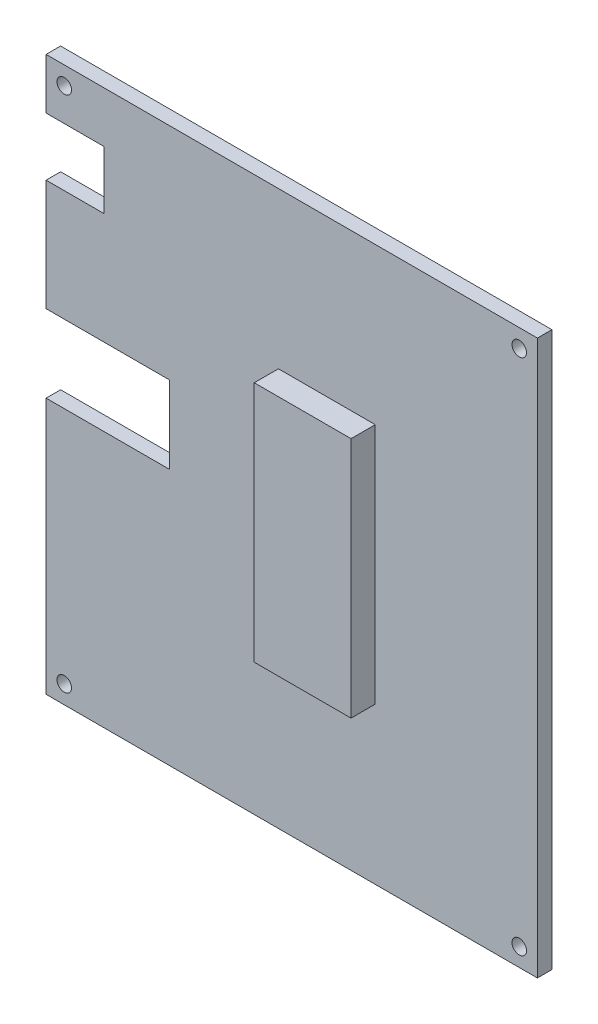
ISO-10303-21;
HEADER;
FILE_DESCRIPTION(('STEP AP214'),'2;1');
FILE_NAME('part.step','',(''),(''),'','','');
FILE_SCHEMA(('AUTOMOTIVE_DESIGN { 1 0 10303 214 1 1 1 1 }'));
ENDSEC;
DATA;
#1=APPLICATION_CONTEXT('core data for automotive mechanical design processes');
#2=APPLICATION_PROTOCOL_DEFINITION('international standard','automotive_design',2000,#1);
#3=PRODUCT_CONTEXT('',#1,'mechanical');
#4=PRODUCT('Part','Part','',(#3));
#5=PRODUCT_RELATED_PRODUCT_CATEGORY('part','',(#4));
#6=PRODUCT_DEFINITION_FORMATION('','',#4);
#7=PRODUCT_DEFINITION_CONTEXT('part definition',#1,'design');
#8=PRODUCT_DEFINITION('design','',#6,#7);
#9=PRODUCT_DEFINITION_SHAPE('','',#8);
#10=(LENGTH_UNIT() NAMED_UNIT(*) SI_UNIT(.MILLI.,.METRE.));
#11=(NAMED_UNIT(*) PLANE_ANGLE_UNIT() SI_UNIT($,.RADIAN.));
#12=(NAMED_UNIT(*) SI_UNIT($,.STERADIAN.) SOLID_ANGLE_UNIT());
#13=UNCERTAINTY_MEASURE_WITH_UNIT(LENGTH_MEASURE(1.E-05),#10,'distance_accuracy_value','');
#14=(GEOMETRIC_REPRESENTATION_CONTEXT(3) GLOBAL_UNCERTAINTY_ASSIGNED_CONTEXT((#13)) GLOBAL_UNIT_ASSIGNED_CONTEXT((#10,
#11,#12)) REPRESENTATION_CONTEXT('',''));
#15=CARTESIAN_POINT('',(0.,0.,0.));
#16=DIRECTION('',(0.,0.,1.));
#17=DIRECTION('',(1.,0.,0.));
#18=AXIS2_PLACEMENT_3D('',#15,#16,#17);
#19=CARTESIAN_POINT('',(50.75,-119.174028952859,3.));
#20=DIRECTION('',(-1.,0.,0.));
#21=DIRECTION('',(0.,0.,1.));
#22=AXIS2_PLACEMENT_3D('',#19,#20,#21);
#23=PLANE('',#22);
#24=DIRECTION('',(0.,1.,0.));
#25=VECTOR('',#24,1.);
#26=CARTESIAN_POINT('',(50.75,-119.174028952859,0.));
#27=LINE('',#26,#25);
#28=CARTESIAN_POINT('',(50.75,-57.25,0.));
#29=VERTEX_POINT('',#28);
#30=CARTESIAN_POINT('',(50.75,57.25,0.));
#31=VERTEX_POINT('',#30);
#32=EDGE_CURVE('E238',#29,#31,#27,.T.);
#33=ORIENTED_EDGE('',*,*,#32,.T.);
#34=DIRECTION('',(0.,0.,-1.));
#35=VECTOR('',#34,1.);
#36=CARTESIAN_POINT('',(50.75,57.25,3.));
#37=LINE('',#36,#35);
#38=CARTESIAN_POINT('',(50.75,57.25,3.));
#39=VERTEX_POINT('',#38);
#40=EDGE_CURVE('E11',#39,#31,#37,.T.);
#41=ORIENTED_EDGE('',*,*,#40,.F.);
#42=DIRECTION('',(0.,1.,0.));
#43=VECTOR('',#42,1.);
#44=CARTESIAN_POINT('',(50.75,-119.174028952859,3.));
#45=LINE('',#44,#43);
#46=CARTESIAN_POINT('',(50.75,-57.25,3.));
#47=VERTEX_POINT('',#46);
#48=EDGE_CURVE('E201',#47,#39,#45,.T.);
#49=ORIENTED_EDGE('',*,*,#48,.F.);
#50=DIRECTION('',(0.,0.,-1.));
#51=VECTOR('',#50,1.);
#52=CARTESIAN_POINT('',(50.75,-57.25,3.));
#53=LINE('',#52,#51);
#54=EDGE_CURVE('E226',#47,#29,#53,.T.);
#55=ORIENTED_EDGE('',*,*,#54,.T.);
#56=EDGE_LOOP('',(#33,#41,#49,#55));
#57=FACE_BOUND('',#56,.T.);
#58=ADVANCED_FACE('F37',(#57),#23,.F.);
#59=CARTESIAN_POINT('',(0.,57.25,3.));
#60=DIRECTION('',(0.,-1.,0.));
#61=DIRECTION('',(0.,0.,-1.));
#62=AXIS2_PLACEMENT_3D('',#59,#60,#61);
#63=PLANE('',#62);
#64=DIRECTION('',(-1.,0.,0.));
#65=VECTOR('',#64,1.);
#66=CARTESIAN_POINT('',(0.,57.25,0.));
#67=LINE('',#66,#65);
#68=CARTESIAN_POINT('',(-50.75,57.25,0.));
#69=VERTEX_POINT('',#68);
#70=EDGE_CURVE('E241',#31,#69,#67,.T.);
#71=ORIENTED_EDGE('',*,*,#70,.T.);
#72=DIRECTION('',(0.,0.,-1.));
#73=VECTOR('',#72,1.);
#74=CARTESIAN_POINT('',(-50.75,57.25,3.));
#75=LINE('',#74,#73);
#76=CARTESIAN_POINT('',(-50.75,57.25,3.));
#77=VERTEX_POINT('',#76);
#78=EDGE_CURVE('E45',#77,#69,#75,.T.);
#79=ORIENTED_EDGE('',*,*,#78,.F.);
#80=DIRECTION('',(-1.,0.,0.));
#81=VECTOR('',#80,1.);
#82=CARTESIAN_POINT('',(0.,57.25,3.));
#83=LINE('',#82,#81);
#84=EDGE_CURVE('E204',#39,#77,#83,.T.);
#85=ORIENTED_EDGE('',*,*,#84,.F.);
#86=ORIENTED_EDGE('',*,*,#40,.T.);
#87=EDGE_LOOP('',(#71,#79,#85,#86));
#88=FACE_BOUND('',#87,.T.);
#89=ADVANCED_FACE('F318',(#88),#63,.F.);
#90=CARTESIAN_POINT('',(-50.75,-119.174028952859,3.));
#91=DIRECTION('',(1.,0.,0.));
#92=DIRECTION('',(0.,0.,-1.));
#93=AXIS2_PLACEMENT_3D('',#90,#91,#92);
#94=PLANE('',#93);
#95=DIRECTION('',(0.,-1.,0.));
#96=VECTOR('',#95,1.);
#97=CARTESIAN_POINT('',(-50.75,-119.174028952859,0.));
#98=LINE('',#97,#96);
#99=CARTESIAN_POINT('',(-50.75,46.75,0.));
#100=VERTEX_POINT('',#99);
#101=EDGE_CURVE('E243',#69,#100,#98,.T.);
#102=ORIENTED_EDGE('',*,*,#101,.T.);
#103=DIRECTION('',(0.,0.,-1.));
#104=VECTOR('',#103,1.);
#105=CARTESIAN_POINT('',(-50.75,46.75,3.));
#106=LINE('',#105,#104);
#107=CARTESIAN_POINT('',(-50.75,46.75,3.));
#108=VERTEX_POINT('',#107);
#109=EDGE_CURVE('E288',#108,#100,#106,.T.);
#110=ORIENTED_EDGE('',*,*,#109,.F.);
#111=DIRECTION('',(0.,-1.,0.));
#112=VECTOR('',#111,1.);
#113=CARTESIAN_POINT('',(-50.75,-119.174028952859,3.));
#114=LINE('',#113,#112);
#115=EDGE_CURVE('E206',#77,#108,#114,.T.);
#116=ORIENTED_EDGE('',*,*,#115,.F.);
#117=ORIENTED_EDGE('',*,*,#78,.T.);
#118=EDGE_LOOP('',(#102,#110,#116,#117));
#119=FACE_BOUND('',#118,.T.);
#120=ADVANCED_FACE('F295',(#119),#94,.F.);
#121=CARTESIAN_POINT('',(-1.80267248250089E-13,46.7500000000001,3.));
#122=DIRECTION('',(0.,1.,0.));
#123=DIRECTION('',(-1.,0.,0.));
#124=AXIS2_PLACEMENT_3D('',#121,#122,#123);
#125=PLANE('',#124);
#126=DIRECTION('',(1.,0.,0.));
#127=VECTOR('',#126,1.);
#128=CARTESIAN_POINT('',(-1.80267248250089E-13,46.7500000000001,0.));
#129=LINE('',#128,#127);
#130=CARTESIAN_POINT('',(-38.75,46.75,0.));
#131=VERTEX_POINT('',#130);
#132=EDGE_CURVE('E245',#100,#131,#129,.T.);
#133=ORIENTED_EDGE('',*,*,#132,.T.);
#134=DIRECTION('',(0.,0.,-1.));
#135=VECTOR('',#134,1.);
#136=CARTESIAN_POINT('',(-38.75,46.75,3.));
#137=LINE('',#136,#135);
#138=CARTESIAN_POINT('',(-38.75,46.75,3.));
#139=VERTEX_POINT('',#138);
#140=EDGE_CURVE('E285',#139,#131,#137,.T.);
#141=ORIENTED_EDGE('',*,*,#140,.F.);
#142=DIRECTION('',(1.,0.,0.));
#143=VECTOR('',#142,1.);
#144=CARTESIAN_POINT('',(-1.80267248250089E-13,46.7500000000001,3.));
#145=LINE('',#144,#143);
#146=EDGE_CURVE('E208',#108,#139,#145,.T.);
#147=ORIENTED_EDGE('',*,*,#146,.F.);
#148=ORIENTED_EDGE('',*,*,#109,.T.);
#149=EDGE_LOOP('',(#133,#141,#147,#148));
#150=FACE_BOUND('',#149,.T.);
#151=ADVANCED_FACE('F306',(#150),#125,.F.);
#152=CARTESIAN_POINT('',(-38.75,-119.174028952859,3.));
#153=DIRECTION('',(1.,0.,0.));
#154=DIRECTION('',(0.,0.,-1.));
#155=AXIS2_PLACEMENT_3D('',#152,#153,#154);
#156=PLANE('',#155);
#157=DIRECTION('',(0.,-1.,0.));
#158=VECTOR('',#157,1.);
#159=CARTESIAN_POINT('',(-38.75,-119.174028952859,0.));
#160=LINE('',#159,#158);
#161=CARTESIAN_POINT('',(-38.75,34.75,0.));
#162=VERTEX_POINT('',#161);
#163=EDGE_CURVE('E247',#131,#162,#160,.T.);
#164=ORIENTED_EDGE('',*,*,#163,.T.);
#165=DIRECTION('',(0.,0.,-1.));
#166=VECTOR('',#165,1.);
#167=CARTESIAN_POINT('',(-38.75,34.75,3.));
#168=LINE('',#167,#166);
#169=CARTESIAN_POINT('',(-38.75,34.75,3.));
#170=VERTEX_POINT('',#169);
#171=EDGE_CURVE('E282',#170,#162,#168,.T.);
#172=ORIENTED_EDGE('',*,*,#171,.F.);
#173=DIRECTION('',(0.,-1.,0.));
#174=VECTOR('',#173,1.);
#175=CARTESIAN_POINT('',(-38.75,-119.174028952859,3.));
#176=LINE('',#175,#174);
#177=EDGE_CURVE('E210',#139,#170,#176,.T.);
#178=ORIENTED_EDGE('',*,*,#177,.F.);
#179=ORIENTED_EDGE('',*,*,#140,.T.);
#180=EDGE_LOOP('',(#164,#172,#178,#179));
#181=FACE_BOUND('',#180,.T.);
#182=ADVANCED_FACE('F310',(#181),#156,.F.);
#183=CARTESIAN_POINT('',(1.00626166099184E-13,34.75,3.));
#184=DIRECTION('',(0.,-1.,0.));
#185=DIRECTION('',(1.,0.,0.));
#186=AXIS2_PLACEMENT_3D('',#183,#184,#185);
#187=PLANE('',#186);
#188=DIRECTION('',(-1.,0.,0.));
#189=VECTOR('',#188,1.);
#190=CARTESIAN_POINT('',(1.00626166099184E-13,34.75,0.));
#191=LINE('',#190,#189);
#192=CARTESIAN_POINT('',(-50.75,34.75,0.));
#193=VERTEX_POINT('',#192);
#194=EDGE_CURVE('E249',#162,#193,#191,.T.);
#195=ORIENTED_EDGE('',*,*,#194,.T.);
#196=DIRECTION('',(0.,0.,-1.));
#197=VECTOR('',#196,1.);
#198=CARTESIAN_POINT('',(-50.75,34.75,3.));
#199=LINE('',#198,#197);
#200=CARTESIAN_POINT('',(-50.75,34.75,3.));
#201=VERTEX_POINT('',#200);
#202=EDGE_CURVE('E279',#201,#193,#199,.T.);
#203=ORIENTED_EDGE('',*,*,#202,.F.);
#204=DIRECTION('',(-1.,0.,0.));
#205=VECTOR('',#204,1.);
#206=CARTESIAN_POINT('',(1.00626166099184E-13,34.75,3.));
#207=LINE('',#206,#205);
#208=EDGE_CURVE('E212',#170,#201,#207,.T.);
#209=ORIENTED_EDGE('',*,*,#208,.F.);
#210=ORIENTED_EDGE('',*,*,#171,.T.);
#211=EDGE_LOOP('',(#195,#203,#209,#210));
#212=FACE_BOUND('',#211,.T.);
#213=ADVANCED_FACE('F351',(#212),#187,.F.);
#214=CARTESIAN_POINT('',(-50.75,-119.174028952859,3.));
#215=DIRECTION('',(1.,0.,0.));
#216=DIRECTION('',(0.,0.,-1.));
#217=AXIS2_PLACEMENT_3D('',#214,#215,#216);
#218=PLANE('',#217);
#219=DIRECTION('',(0.,-1.,0.));
#220=VECTOR('',#219,1.);
#221=CARTESIAN_POINT('',(-50.75,-119.174028952859,0.));
#222=LINE('',#221,#220);
#223=CARTESIAN_POINT('',(-50.75,11.75,0.));
#224=VERTEX_POINT('',#223);
#225=EDGE_CURVE('E251',#193,#224,#222,.T.);
#226=ORIENTED_EDGE('',*,*,#225,.T.);
#227=DIRECTION('',(0.,0.,-1.));
#228=VECTOR('',#227,1.);
#229=CARTESIAN_POINT('',(-50.75,11.75,3.));
#230=LINE('',#229,#228);
#231=CARTESIAN_POINT('',(-50.75,11.75,3.));
#232=VERTEX_POINT('',#231);
#233=EDGE_CURVE('E276',#232,#224,#230,.T.);
#234=ORIENTED_EDGE('',*,*,#233,.F.);
#235=DIRECTION('',(0.,-1.,0.));
#236=VECTOR('',#235,1.);
#237=CARTESIAN_POINT('',(-50.75,-119.174028952859,3.));
#238=LINE('',#237,#236);
#239=EDGE_CURVE('E214',#201,#232,#238,.T.);
#240=ORIENTED_EDGE('',*,*,#239,.F.);
#241=ORIENTED_EDGE('',*,*,#202,.T.);
#242=EDGE_LOOP('',(#226,#234,#240,#241));
#243=FACE_BOUND('',#242,.T.);
#244=ADVANCED_FACE('F349',(#243),#218,.F.);
#245=CARTESIAN_POINT('',(0.,11.75,3.));
#246=DIRECTION('',(0.,1.,0.));
#247=DIRECTION('',(-1.,0.,0.));
#248=AXIS2_PLACEMENT_3D('',#245,#246,#247);
#249=PLANE('',#248);
#250=DIRECTION('',(1.,0.,0.));
#251=VECTOR('',#250,1.);
#252=CARTESIAN_POINT('',(0.,11.75,0.));
#253=LINE('',#252,#251);
#254=CARTESIAN_POINT('',(-25.25,11.75,0.));
#255=VERTEX_POINT('',#254);
#256=EDGE_CURVE('E253',#224,#255,#253,.T.);
#257=ORIENTED_EDGE('',*,*,#256,.T.);
#258=DIRECTION('',(0.,0.,-1.));
#259=VECTOR('',#258,1.);
#260=CARTESIAN_POINT('',(-25.25,11.75,3.));
#261=LINE('',#260,#259);
#262=CARTESIAN_POINT('',(-25.25,11.75,3.));
#263=VERTEX_POINT('',#262);
#264=EDGE_CURVE('E273',#263,#255,#261,.T.);
#265=ORIENTED_EDGE('',*,*,#264,.F.);
#266=DIRECTION('',(1.,0.,0.));
#267=VECTOR('',#266,1.);
#268=CARTESIAN_POINT('',(0.,11.75,3.));
#269=LINE('',#268,#267);
#270=EDGE_CURVE('E216',#232,#263,#269,.T.);
#271=ORIENTED_EDGE('',*,*,#270,.F.);
#272=ORIENTED_EDGE('',*,*,#233,.T.);
#273=EDGE_LOOP('',(#257,#265,#271,#272));
#274=FACE_BOUND('',#273,.T.);
#275=ADVANCED_FACE('F345',(#274),#249,.F.);
#276=CARTESIAN_POINT('',(-25.25,-119.174028952859,3.));
#277=DIRECTION('',(1.,0.,0.));
#278=DIRECTION('',(0.,1.,0.));
#279=AXIS2_PLACEMENT_3D('',#276,#277,#278);
#280=PLANE('',#279);
#281=DIRECTION('',(0.,-1.,0.));
#282=VECTOR('',#281,1.);
#283=CARTESIAN_POINT('',(-25.25,-119.174028952859,0.));
#284=LINE('',#283,#282);
#285=CARTESIAN_POINT('',(-25.25,-4.25,0.));
#286=VERTEX_POINT('',#285);
#287=EDGE_CURVE('E255',#255,#286,#284,.T.);
#288=ORIENTED_EDGE('',*,*,#287,.T.);
#289=DIRECTION('',(0.,0.,-1.));
#290=VECTOR('',#289,1.);
#291=CARTESIAN_POINT('',(-25.25,-4.25,3.));
#292=LINE('',#291,#290);
#293=CARTESIAN_POINT('',(-25.25,-4.25,3.));
#294=VERTEX_POINT('',#293);
#295=EDGE_CURVE('E270',#294,#286,#292,.T.);
#296=ORIENTED_EDGE('',*,*,#295,.F.);
#297=DIRECTION('',(0.,-1.,0.));
#298=VECTOR('',#297,1.);
#299=CARTESIAN_POINT('',(-25.25,-119.174028952859,3.));
#300=LINE('',#299,#298);
#301=EDGE_CURVE('E218',#263,#294,#300,.T.);
#302=ORIENTED_EDGE('',*,*,#301,.F.);
#303=ORIENTED_EDGE('',*,*,#264,.T.);
#304=EDGE_LOOP('',(#288,#296,#302,#303));
#305=FACE_BOUND('',#304,.T.);
#306=ADVANCED_FACE('F340',(#305),#280,.F.);
#307=CARTESIAN_POINT('',(0.,-4.25,3.));
#308=DIRECTION('',(0.,-1.,0.));
#309=DIRECTION('',(0.,0.,-1.));
#310=AXIS2_PLACEMENT_3D('',#307,#308,#309);
#311=PLANE('',#310);
#312=DIRECTION('',(-1.,0.,0.));
#313=VECTOR('',#312,1.);
#314=CARTESIAN_POINT('',(0.,-4.25,0.));
#315=LINE('',#314,#313);
#316=CARTESIAN_POINT('',(-50.75,-4.25,0.));
#317=VERTEX_POINT('',#316);
#318=EDGE_CURVE('E257',#286,#317,#315,.T.);
#319=ORIENTED_EDGE('',*,*,#318,.T.);
#320=DIRECTION('',(0.,0.,-1.));
#321=VECTOR('',#320,1.);
#322=CARTESIAN_POINT('',(-50.75,-4.25,3.));
#323=LINE('',#322,#321);
#324=CARTESIAN_POINT('',(-50.75,-4.25,3.));
#325=VERTEX_POINT('',#324);
#326=EDGE_CURVE('E267',#325,#317,#323,.T.);
#327=ORIENTED_EDGE('',*,*,#326,.F.);
#328=DIRECTION('',(-1.,0.,0.));
#329=VECTOR('',#328,1.);
#330=CARTESIAN_POINT('',(0.,-4.25,3.));
#331=LINE('',#330,#329);
#332=EDGE_CURVE('E220',#294,#325,#331,.T.);
#333=ORIENTED_EDGE('',*,*,#332,.F.);
#334=ORIENTED_EDGE('',*,*,#295,.T.);
#335=EDGE_LOOP('',(#319,#327,#333,#334));
#336=FACE_BOUND('',#335,.T.);
#337=ADVANCED_FACE('F334',(#336),#311,.F.);
#338=CARTESIAN_POINT('',(-50.75,-119.174028952859,3.));
#339=DIRECTION('',(1.,0.,0.));
#340=DIRECTION('',(0.,0.,-1.));
#341=AXIS2_PLACEMENT_3D('',#338,#339,#340);
#342=PLANE('',#341);
#343=DIRECTION('',(0.,-1.,0.));
#344=VECTOR('',#343,1.);
#345=CARTESIAN_POINT('',(-50.75,-119.174028952859,0.));
#346=LINE('',#345,#344);
#347=CARTESIAN_POINT('',(-50.75,-57.25,0.));
#348=VERTEX_POINT('',#347);
#349=EDGE_CURVE('E259',#317,#348,#346,.T.);
#350=ORIENTED_EDGE('',*,*,#349,.T.);
#351=DIRECTION('',(0.,0.,-1.));
#352=VECTOR('',#351,1.);
#353=CARTESIAN_POINT('',(-50.75,-57.25,3.));
#354=LINE('',#353,#352);
#355=CARTESIAN_POINT('',(-50.75,-57.25,3.));
#356=VERTEX_POINT('',#355);
#357=EDGE_CURVE('E264',#356,#348,#354,.T.);
#358=ORIENTED_EDGE('',*,*,#357,.F.);
#359=DIRECTION('',(0.,-1.,0.));
#360=VECTOR('',#359,1.);
#361=CARTESIAN_POINT('',(-50.75,-119.174028952859,3.));
#362=LINE('',#361,#360);
#363=EDGE_CURVE('E222',#325,#356,#362,.T.);
#364=ORIENTED_EDGE('',*,*,#363,.F.);
#365=ORIENTED_EDGE('',*,*,#326,.T.);
#366=EDGE_LOOP('',(#350,#358,#364,#365));
#367=FACE_BOUND('',#366,.T.);
#368=ADVANCED_FACE('F330',(#367),#342,.F.);
#369=CARTESIAN_POINT('',(47.,53.5,3.));
#370=DIRECTION('',(0.,0.,-1.));
#371=DIRECTION('',(-1.,0.,0.));
#372=AXIS2_PLACEMENT_3D('',#369,#370,#371);
#373=CYLINDRICAL_SURFACE('',#372,1.5);
#374=CARTESIAN_POINT('',(47.,53.5,3.));
#375=DIRECTION('',(0.,0.,1.));
#376=DIRECTION('',(1.,0.,0.));
#377=AXIS2_PLACEMENT_3D('',#374,#375,#376);
#378=CIRCLE('',#377,1.5);
#379=CARTESIAN_POINT('',(48.5,53.5,3.));
#380=VERTEX_POINT('',#379);
#381=EDGE_CURVE('E198',#380,#380,#378,.T.);
#382=ORIENTED_EDGE('',*,*,#381,.T.);
#383=EDGE_LOOP('',(#382));
#384=FACE_BOUND('',#383,.T.);
#385=CARTESIAN_POINT('',(47.,53.5,0.));
#386=DIRECTION('',(0.,0.,1.));
#387=DIRECTION('',(1.,0.,0.));
#388=AXIS2_PLACEMENT_3D('',#385,#386,#387);
#389=CIRCLE('',#388,1.5);
#390=CARTESIAN_POINT('',(48.5,53.5,0.));
#391=VERTEX_POINT('',#390);
#392=EDGE_CURVE('E235',#391,#391,#389,.T.);
#393=ORIENTED_EDGE('',*,*,#392,.F.);
#394=EDGE_LOOP('',(#393));
#395=FACE_BOUND('',#394,.T.);
#396=ADVANCED_FACE('F368',(#384,#395),#373,.F.);
#397=CARTESIAN_POINT('',(47.,-53.5,3.));
#398=DIRECTION('',(0.,0.,-1.));
#399=DIRECTION('',(-1.,0.,0.));
#400=AXIS2_PLACEMENT_3D('',#397,#398,#399);
#401=CYLINDRICAL_SURFACE('',#400,1.5);
#402=CARTESIAN_POINT('',(47.,-53.5,3.));
#403=DIRECTION('',(0.,0.,1.));
#404=DIRECTION('',(1.,0.,0.));
#405=AXIS2_PLACEMENT_3D('',#402,#403,#404);
#406=CIRCLE('',#405,1.5);
#407=CARTESIAN_POINT('',(48.5,-53.5,3.));
#408=VERTEX_POINT('',#407);
#409=EDGE_CURVE('E195',#408,#408,#406,.T.);
#410=ORIENTED_EDGE('',*,*,#409,.T.);
#411=EDGE_LOOP('',(#410));
#412=FACE_BOUND('',#411,.T.);
#413=CARTESIAN_POINT('',(47.,-53.5,0.));
#414=DIRECTION('',(0.,0.,1.));
#415=DIRECTION('',(1.,0.,0.));
#416=AXIS2_PLACEMENT_3D('',#413,#414,#415);
#417=CIRCLE('',#416,1.5);
#418=CARTESIAN_POINT('',(48.5,-53.5,0.));
#419=VERTEX_POINT('',#418);
#420=EDGE_CURVE('E232',#419,#419,#417,.T.);
#421=ORIENTED_EDGE('',*,*,#420,.F.);
#422=EDGE_LOOP('',(#421));
#423=FACE_BOUND('',#422,.T.);
#424=ADVANCED_FACE('F371',(#412,#423),#401,.F.);
#425=CARTESIAN_POINT('',(-47.,-53.5,3.));
#426=DIRECTION('',(0.,0.,-1.));
#427=DIRECTION('',(-1.,0.,0.));
#428=AXIS2_PLACEMENT_3D('',#425,#426,#427);
#429=CYLINDRICAL_SURFACE('',#428,1.50000000000001);
#430=CARTESIAN_POINT('',(-47.,-53.5,3.));
#431=DIRECTION('',(0.,0.,1.));
#432=DIRECTION('',(1.,0.,0.));
#433=AXIS2_PLACEMENT_3D('',#430,#431,#432);
#434=CIRCLE('',#433,1.50000000000001);
#435=CARTESIAN_POINT('',(-45.5,-53.5,3.));
#436=VERTEX_POINT('',#435);
#437=EDGE_CURVE('E191',#436,#436,#434,.T.);
#438=ORIENTED_EDGE('',*,*,#437,.T.);
#439=EDGE_LOOP('',(#438));
#440=FACE_BOUND('',#439,.T.);
#441=CARTESIAN_POINT('',(-47.,-53.5,0.));
#442=DIRECTION('',(0.,0.,1.));
#443=DIRECTION('',(1.,0.,0.));
#444=AXIS2_PLACEMENT_3D('',#441,#442,#443);
#445=CIRCLE('',#444,1.50000000000001);
#446=CARTESIAN_POINT('',(-45.5,-53.5,0.));
#447=VERTEX_POINT('',#446);
#448=EDGE_CURVE('E229',#447,#447,#445,.T.);
#449=ORIENTED_EDGE('',*,*,#448,.F.);
#450=EDGE_LOOP('',(#449));
#451=FACE_BOUND('',#450,.T.);
#452=ADVANCED_FACE('F374',(#440,#451),#429,.F.);
#453=CARTESIAN_POINT('',(-47.,53.5,3.));
#454=DIRECTION('',(0.,0.,-1.));
#455=DIRECTION('',(-1.,0.,0.));
#456=AXIS2_PLACEMENT_3D('',#453,#454,#455);
#457=CYLINDRICAL_SURFACE('',#456,1.5);
#458=CARTESIAN_POINT('',(-47.,53.5,3.));
#459=DIRECTION('',(0.,0.,1.));
#460=DIRECTION('',(1.,0.,0.));
#461=AXIS2_PLACEMENT_3D('',#458,#459,#460);
#462=CIRCLE('',#461,1.5);
#463=CARTESIAN_POINT('',(-45.5,53.5,3.));
#464=VERTEX_POINT('',#463);
#465=EDGE_CURVE('E188',#464,#464,#462,.T.);
#466=ORIENTED_EDGE('',*,*,#465,.T.);
#467=EDGE_LOOP('',(#466));
#468=FACE_BOUND('',#467,.T.);
#469=CARTESIAN_POINT('',(-47.,53.5,0.));
#470=DIRECTION('',(0.,0.,1.));
#471=DIRECTION('',(1.,0.,0.));
#472=AXIS2_PLACEMENT_3D('',#469,#470,#471);
#473=CIRCLE('',#472,1.5);
#474=CARTESIAN_POINT('',(-45.5,53.5,0.));
#475=VERTEX_POINT('',#474);
#476=EDGE_CURVE('E187',#475,#475,#473,.T.);
#477=ORIENTED_EDGE('',*,*,#476,.F.);
#478=EDGE_LOOP('',(#477));
#479=FACE_BOUND('',#478,.T.);
#480=ADVANCED_FACE('F39',(#468,#479),#457,.F.);
#481=CARTESIAN_POINT('',(0.,-57.25,3.));
#482=DIRECTION('',(0.,1.,0.));
#483=DIRECTION('',(0.,0.,1.));
#484=AXIS2_PLACEMENT_3D('',#481,#482,#483);
#485=PLANE('',#484);
#486=DIRECTION('',(1.,0.,0.));
#487=VECTOR('',#486,1.);
#488=CARTESIAN_POINT('',(0.,-57.25,0.));
#489=LINE('',#488,#487);
#490=EDGE_CURVE('E192',#348,#29,#489,.T.);
#491=ORIENTED_EDGE('',*,*,#490,.T.);
#492=ORIENTED_EDGE('',*,*,#54,.F.);
#493=DIRECTION('',(1.,0.,0.));
#494=VECTOR('',#493,1.);
#495=CARTESIAN_POINT('',(0.,-57.25,3.));
#496=LINE('',#495,#494);
#497=EDGE_CURVE('E224',#356,#47,#496,.T.);
#498=ORIENTED_EDGE('',*,*,#497,.F.);
#499=ORIENTED_EDGE('',*,*,#357,.T.);
#500=EDGE_LOOP('',(#491,#492,#498,#499));
#501=FACE_BOUND('',#500,.T.);
#502=ADVANCED_FACE('F325',(#501),#485,.F.);
#503=CARTESIAN_POINT('',(0.,-119.174028952859,3.));
#504=DIRECTION('',(0.,0.,1.));
#505=DIRECTION('',(1.,0.,0.));
#506=AXIS2_PLACEMENT_3D('',#503,#504,#505);
#507=PLANE('',#506);
#508=DIRECTION('',(0.,1.,0.));
#509=VECTOR('',#508,1.);
#510=CARTESIAN_POINT('',(17.2523329689602,-119.174028952859,3.));
#511=LINE('',#510,#509);
#512=CARTESIAN_POINT('',(17.2523329689602,-25.,3.));
#513=VERTEX_POINT('',#512);
#514=CARTESIAN_POINT('',(17.2523329689602,25.,3.));
#515=VERTEX_POINT('',#514);
#516=EDGE_CURVE('E185',#513,#515,#511,.T.);
#517=ORIENTED_EDGE('',*,*,#516,.F.);
#518=DIRECTION('',(1.,0.,0.));
#519=VECTOR('',#518,1.);
#520=CARTESIAN_POINT('',(0.,-25.,3.));
#521=LINE('',#520,#519);
#522=CARTESIAN_POINT('',(-2.74766703103979,-25.,3.));
#523=VERTEX_POINT('',#522);
#524=EDGE_CURVE('E154',#523,#513,#521,.T.);
#525=ORIENTED_EDGE('',*,*,#524,.F.);
#526=DIRECTION('',(0.,-1.,0.));
#527=VECTOR('',#526,1.);
#528=CARTESIAN_POINT('',(-2.74766703103979,-119.174028952859,3.));
#529=LINE('',#528,#527);
#530=CARTESIAN_POINT('',(-2.74766703103979,25.,3.));
#531=VERTEX_POINT('',#530);
#532=EDGE_CURVE('E57',#531,#523,#529,.T.);
#533=ORIENTED_EDGE('',*,*,#532,.F.);
#534=DIRECTION('',(-1.,0.,0.));
#535=VECTOR('',#534,1.);
#536=CARTESIAN_POINT('',(0.,25.,3.));
#537=LINE('',#536,#535);
#538=EDGE_CURVE('E52',#515,#531,#537,.T.);
#539=ORIENTED_EDGE('',*,*,#538,.F.);
#540=EDGE_LOOP('',(#517,#525,#533,#539));
#541=FACE_BOUND('',#540,.T.);
#542=ORIENTED_EDGE('',*,*,#465,.F.);
#543=EDGE_LOOP('',(#542));
#544=FACE_BOUND('',#543,.T.);
#545=ORIENTED_EDGE('',*,*,#437,.F.);
#546=EDGE_LOOP('',(#545));
#547=FACE_BOUND('',#546,.T.);
#548=ORIENTED_EDGE('',*,*,#409,.F.);
#549=EDGE_LOOP('',(#548));
#550=FACE_BOUND('',#549,.T.);
#551=ORIENTED_EDGE('',*,*,#381,.F.);
#552=EDGE_LOOP('',(#551));
#553=FACE_BOUND('',#552,.T.);
#554=ORIENTED_EDGE('',*,*,#48,.T.);
#555=ORIENTED_EDGE('',*,*,#84,.T.);
#556=ORIENTED_EDGE('',*,*,#115,.T.);
#557=ORIENTED_EDGE('',*,*,#146,.T.);
#558=ORIENTED_EDGE('',*,*,#177,.T.);
#559=ORIENTED_EDGE('',*,*,#208,.T.);
#560=ORIENTED_EDGE('',*,*,#239,.T.);
#561=ORIENTED_EDGE('',*,*,#270,.T.);
#562=ORIENTED_EDGE('',*,*,#301,.T.);
#563=ORIENTED_EDGE('',*,*,#332,.T.);
#564=ORIENTED_EDGE('',*,*,#363,.T.);
#565=ORIENTED_EDGE('',*,*,#497,.T.);
#566=EDGE_LOOP('',(#554,#555,#556,#557,#558,#559,#560,#561,#562,#563,#564,#565));
#567=FACE_BOUND('',#566,.T.);
#568=ADVANCED_FACE('F314',(#541,#544,#547,#550,#553,#567),#507,.T.);
#569=CARTESIAN_POINT('',(0.,-119.174028952859,0.));
#570=DIRECTION('',(0.,0.,1.));
#571=DIRECTION('',(1.,0.,0.));
#572=AXIS2_PLACEMENT_3D('',#569,#570,#571);
#573=PLANE('',#572);
#574=ORIENTED_EDGE('',*,*,#476,.T.);
#575=EDGE_LOOP('',(#574));
#576=FACE_BOUND('',#575,.T.);
#577=ORIENTED_EDGE('',*,*,#448,.T.);
#578=EDGE_LOOP('',(#577));
#579=FACE_BOUND('',#578,.T.);
#580=ORIENTED_EDGE('',*,*,#420,.T.);
#581=EDGE_LOOP('',(#580));
#582=FACE_BOUND('',#581,.T.);
#583=ORIENTED_EDGE('',*,*,#392,.T.);
#584=EDGE_LOOP('',(#583));
#585=FACE_BOUND('',#584,.T.);
#586=ORIENTED_EDGE('',*,*,#32,.F.);
#587=ORIENTED_EDGE('',*,*,#490,.F.);
#588=ORIENTED_EDGE('',*,*,#349,.F.);
#589=ORIENTED_EDGE('',*,*,#318,.F.);
#590=ORIENTED_EDGE('',*,*,#287,.F.);
#591=ORIENTED_EDGE('',*,*,#256,.F.);
#592=ORIENTED_EDGE('',*,*,#225,.F.);
#593=ORIENTED_EDGE('',*,*,#194,.F.);
#594=ORIENTED_EDGE('',*,*,#163,.F.);
#595=ORIENTED_EDGE('',*,*,#132,.F.);
#596=ORIENTED_EDGE('',*,*,#101,.F.);
#597=ORIENTED_EDGE('',*,*,#70,.F.);
#598=EDGE_LOOP('',(#586,#587,#588,#589,#590,#591,#592,#593,#594,#595,#596,#597));
#599=FACE_BOUND('',#598,.T.);
#600=ADVANCED_FACE('F301',(#576,#579,#582,#585,#599),#573,.F.);
#601=CARTESIAN_POINT('',(17.2523329689602,-25.,8.));
#602=DIRECTION('',(1.,0.,0.));
#603=DIRECTION('',(0.,1.,0.));
#604=AXIS2_PLACEMENT_3D('',#601,#602,#603);
#605=PLANE('',#604);
#606=DIRECTION('',(0.,0.,-1.));
#607=VECTOR('',#606,1.);
#608=CARTESIAN_POINT('',(17.2523329689602,-25.,8.));
#609=LINE('',#608,#607);
#610=CARTESIAN_POINT('',(17.2523329689602,-25.,8.));
#611=VERTEX_POINT('',#610);
#612=EDGE_CURVE('E149',#611,#513,#609,.T.);
#613=ORIENTED_EDGE('',*,*,#612,.T.);
#614=ORIENTED_EDGE('',*,*,#516,.T.);
#615=DIRECTION('',(0.,0.,-1.));
#616=VECTOR('',#615,1.);
#617=CARTESIAN_POINT('',(17.2523329689602,25.,8.));
#618=LINE('',#617,#616);
#619=CARTESIAN_POINT('',(17.2523329689602,25.,8.));
#620=VERTEX_POINT('',#619);
#621=EDGE_CURVE('E172',#620,#515,#618,.T.);
#622=ORIENTED_EDGE('',*,*,#621,.F.);
#623=DIRECTION('',(0.,-1.,0.));
#624=VECTOR('',#623,1.);
#625=CARTESIAN_POINT('',(17.2523329689602,-25.,8.));
#626=LINE('',#625,#624);
#627=EDGE_CURVE('E165',#620,#611,#626,.T.);
#628=ORIENTED_EDGE('',*,*,#627,.T.);
#629=EDGE_LOOP('',(#613,#614,#622,#628));
#630=FACE_BOUND('',#629,.T.);
#631=ADVANCED_FACE('F170',(#630),#605,.T.);
#632=CARTESIAN_POINT('',(-2.74766703103979,25.,8.));
#633=DIRECTION('',(0.,1.,0.));
#634=DIRECTION('',(0.,0.,1.));
#635=AXIS2_PLACEMENT_3D('',#632,#633,#634);
#636=PLANE('',#635);
#637=ORIENTED_EDGE('',*,*,#621,.T.);
#638=ORIENTED_EDGE('',*,*,#538,.T.);
#639=DIRECTION('',(0.,0.,-1.));
#640=VECTOR('',#639,1.);
#641=CARTESIAN_POINT('',(-2.74766703103979,25.,8.));
#642=LINE('',#641,#640);
#643=CARTESIAN_POINT('',(-2.74766703103979,25.,8.));
#644=VERTEX_POINT('',#643);
#645=EDGE_CURVE('E178',#644,#531,#642,.T.);
#646=ORIENTED_EDGE('',*,*,#645,.F.);
#647=DIRECTION('',(1.,0.,0.));
#648=VECTOR('',#647,1.);
#649=CARTESIAN_POINT('',(-2.74766703103979,25.,8.));
#650=LINE('',#649,#648);
#651=EDGE_CURVE('E158',#644,#620,#650,.T.);
#652=ORIENTED_EDGE('',*,*,#651,.T.);
#653=EDGE_LOOP('',(#637,#638,#646,#652));
#654=FACE_BOUND('',#653,.T.);
#655=ADVANCED_FACE('F399',(#654),#636,.T.);
#656=CARTESIAN_POINT('',(-2.74766703103979,-25.,8.));
#657=DIRECTION('',(-1.,0.,0.));
#658=DIRECTION('',(0.,0.,1.));
#659=AXIS2_PLACEMENT_3D('',#656,#657,#658);
#660=PLANE('',#659);
#661=ORIENTED_EDGE('',*,*,#645,.T.);
#662=ORIENTED_EDGE('',*,*,#532,.T.);
#663=DIRECTION('',(0.,0.,-1.));
#664=VECTOR('',#663,1.);
#665=CARTESIAN_POINT('',(-2.74766703103979,-25.,8.));
#666=LINE('',#665,#664);
#667=CARTESIAN_POINT('',(-2.74766703103979,-25.,8.));
#668=VERTEX_POINT('',#667);
#669=EDGE_CURVE('E157',#668,#523,#666,.T.);
#670=ORIENTED_EDGE('',*,*,#669,.F.);
#671=DIRECTION('',(0.,1.,0.));
#672=VECTOR('',#671,1.);
#673=CARTESIAN_POINT('',(-2.74766703103979,-25.,8.));
#674=LINE('',#673,#672);
#675=EDGE_CURVE('E168',#668,#644,#674,.T.);
#676=ORIENTED_EDGE('',*,*,#675,.T.);
#677=EDGE_LOOP('',(#661,#662,#670,#676));
#678=FACE_BOUND('',#677,.T.);
#679=ADVANCED_FACE('F477',(#678),#660,.T.);
#680=CARTESIAN_POINT('',(-2.74766703103979,-25.,8.));
#681=DIRECTION('',(0.,-1.,0.));
#682=DIRECTION('',(0.,0.,-1.));
#683=AXIS2_PLACEMENT_3D('',#680,#681,#682);
#684=PLANE('',#683);
#685=ORIENTED_EDGE('',*,*,#669,.T.);
#686=ORIENTED_EDGE('',*,*,#524,.T.);
#687=ORIENTED_EDGE('',*,*,#612,.F.);
#688=DIRECTION('',(-1.,0.,0.));
#689=VECTOR('',#688,1.);
#690=CARTESIAN_POINT('',(-2.74766703103979,-25.,8.));
#691=LINE('',#690,#689);
#692=EDGE_CURVE('E153',#611,#668,#691,.T.);
#693=ORIENTED_EDGE('',*,*,#692,.T.);
#694=EDGE_LOOP('',(#685,#686,#687,#693));
#695=FACE_BOUND('',#694,.T.);
#696=ADVANCED_FACE('F152',(#695),#684,.T.);
#697=CARTESIAN_POINT('',(17.2523329689602,25.,8.));
#698=DIRECTION('',(0.,0.,-1.));
#699=DIRECTION('',(-1.,0.,0.));
#700=AXIS2_PLACEMENT_3D('',#697,#698,#699);
#701=PLANE('',#700);
#702=ORIENTED_EDGE('',*,*,#627,.F.);
#703=ORIENTED_EDGE('',*,*,#651,.F.);
#704=ORIENTED_EDGE('',*,*,#675,.F.);
#705=ORIENTED_EDGE('',*,*,#692,.F.);
#706=EDGE_LOOP('',(#702,#703,#704,#705));
#707=FACE_BOUND('',#706,.T.);
#708=ADVANCED_FACE('F163',(#707),#701,.F.);
#709=CLOSED_SHELL('',(#58,#89,#120,#151,#182,#213,#244,#275,#306,#337,#368,#396,#424,#452,#480,
#502,#568,#600,#631,#655,#679,#696,#708));
#710=MANIFOLD_SOLID_BREP('B2',#709);
#711=ADVANCED_BREP_SHAPE_REPRESENTATION('',(#18,#710),#14);
#712=SHAPE_DEFINITION_REPRESENTATION(#9,#711);
ENDSEC;
END-ISO-10303-21;
